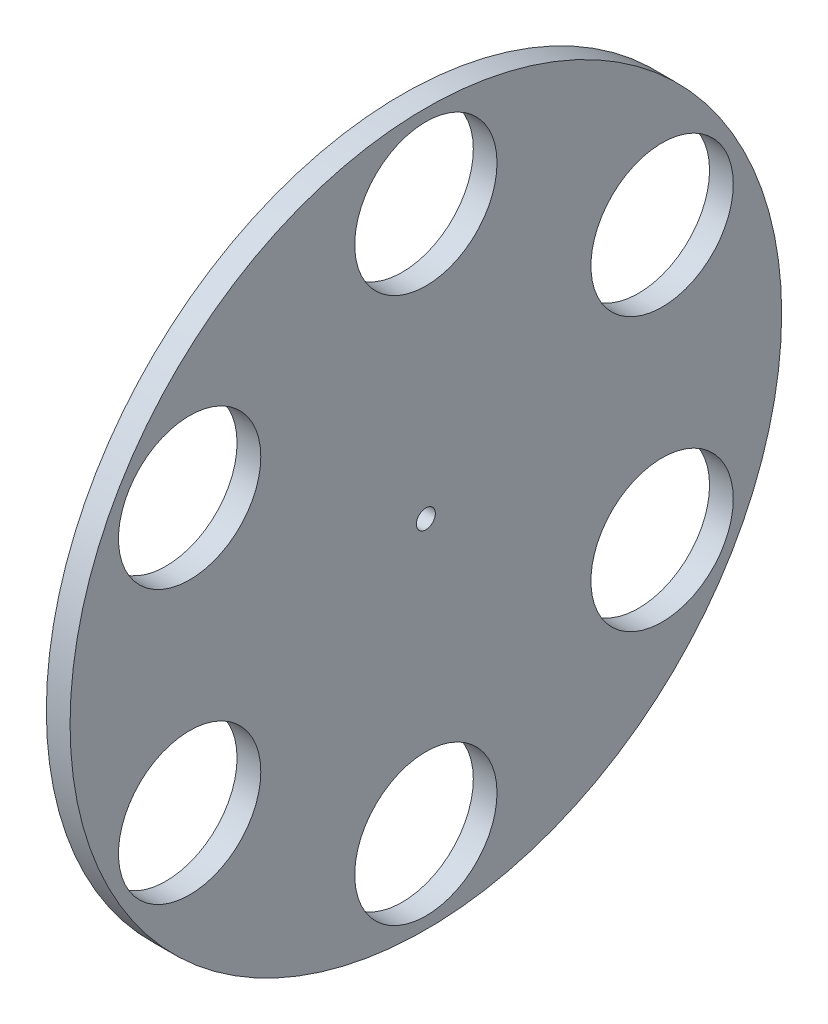
ISO-10303-21;
HEADER;
FILE_DESCRIPTION(('STEP AP214'),'2;1');
FILE_NAME('part.step','',(''),(''),'','','');
FILE_SCHEMA(('AUTOMOTIVE_DESIGN { 1 0 10303 214 1 1 1 1 }'));
ENDSEC;
DATA;
#1=APPLICATION_CONTEXT('core data for automotive mechanical design processes');
#2=APPLICATION_PROTOCOL_DEFINITION('international standard','automotive_design',2000,#1);
#3=PRODUCT_CONTEXT('',#1,'mechanical');
#4=PRODUCT('Part','Part','',(#3));
#5=PRODUCT_RELATED_PRODUCT_CATEGORY('part','',(#4));
#6=PRODUCT_DEFINITION_FORMATION('','',#4);
#7=PRODUCT_DEFINITION_CONTEXT('part definition',#1,'design');
#8=PRODUCT_DEFINITION('design','',#6,#7);
#9=PRODUCT_DEFINITION_SHAPE('','',#8);
#10=(LENGTH_UNIT() NAMED_UNIT(*) SI_UNIT(.MILLI.,.METRE.));
#11=(NAMED_UNIT(*) PLANE_ANGLE_UNIT() SI_UNIT($,.RADIAN.));
#12=(NAMED_UNIT(*) SI_UNIT($,.STERADIAN.) SOLID_ANGLE_UNIT());
#13=UNCERTAINTY_MEASURE_WITH_UNIT(LENGTH_MEASURE(1.E-05),#10,'distance_accuracy_value','');
#14=(GEOMETRIC_REPRESENTATION_CONTEXT(3) GLOBAL_UNCERTAINTY_ASSIGNED_CONTEXT((#13)) GLOBAL_UNIT_ASSIGNED_CONTEXT((#10,
#11,#12)) REPRESENTATION_CONTEXT('',''));
#15=CARTESIAN_POINT('',(0.,0.,0.));
#16=DIRECTION('',(0.,0.,1.));
#17=DIRECTION('',(1.,0.,0.));
#18=AXIS2_PLACEMENT_3D('',#15,#16,#17);
#19=CARTESIAN_POINT('',(10.,0.,0.));
#20=DIRECTION('',(1.,0.,0.));
#21=DIRECTION('',(0.,0.,-1.));
#22=AXIS2_PLACEMENT_3D('',#19,#20,#21);
#23=PLANE('',#22);
#24=CARTESIAN_POINT('',(10.,-57.5000000000089,99.5929214351951));
#25=DIRECTION('',(1.,0.,0.));
#26=DIRECTION('',(0.,0.,-1.));
#27=AXIS2_PLACEMENT_3D('',#24,#25,#26);
#28=CIRCLE('',#27,30.);
#29=CARTESIAN_POINT('',(10.,-57.5000000000089,69.5929214351951));
#30=VERTEX_POINT('',#29);
#31=EDGE_CURVE('E71',#30,#30,#28,.T.);
#32=ORIENTED_EDGE('',*,*,#31,.F.);
#33=EDGE_LOOP('',(#32));
#34=FACE_BOUND('',#33,.T.);
#35=CARTESIAN_POINT('',(10.,-57.4999999999911,-99.5929214352258));
#36=DIRECTION('',(1.,0.,0.));
#37=DIRECTION('',(0.,0.,-1.));
#38=AXIS2_PLACEMENT_3D('',#35,#36,#37);
#39=CIRCLE('',#38,30.);
#40=CARTESIAN_POINT('',(10.,-57.4999999999911,-129.592921435226));
#41=VERTEX_POINT('',#40);
#42=EDGE_CURVE('E59',#41,#41,#39,.T.);
#43=ORIENTED_EDGE('',*,*,#42,.F.);
#44=EDGE_LOOP('',(#43));
#45=FACE_BOUND('',#44,.T.);
#46=CARTESIAN_POINT('',(10.,115.,0.));
#47=DIRECTION('',(1.,0.,0.));
#48=DIRECTION('',(0.,0.,-1.));
#49=AXIS2_PLACEMENT_3D('',#46,#47,#48);
#50=CIRCLE('',#49,30.);
#51=CARTESIAN_POINT('',(10.,115.,-30.));
#52=VERTEX_POINT('',#51);
#53=EDGE_CURVE('E47',#52,#52,#50,.T.);
#54=ORIENTED_EDGE('',*,*,#53,.F.);
#55=EDGE_LOOP('',(#54));
#56=FACE_BOUND('',#55,.T.);
#57=CARTESIAN_POINT('',(10.,0.,0.));
#58=DIRECTION('',(1.,0.,0.));
#59=DIRECTION('',(0.,0.,-1.));
#60=AXIS2_PLACEMENT_3D('',#57,#58,#59);
#61=CIRCLE('',#60,150.);
#62=CARTESIAN_POINT('',(10.,0.,-150.));
#63=VERTEX_POINT('',#62);
#64=EDGE_CURVE('E10',#63,#63,#61,.T.);
#65=ORIENTED_EDGE('',*,*,#64,.T.);
#66=EDGE_LOOP('',(#65));
#67=FACE_BOUND('',#66,.T.);
#68=CARTESIAN_POINT('',(10.,0.,0.));
#69=DIRECTION('',(1.,0.,0.));
#70=DIRECTION('',(0.,0.,-1.));
#71=AXIS2_PLACEMENT_3D('',#68,#69,#70);
#72=CIRCLE('',#71,4.);
#73=CARTESIAN_POINT('',(10.,0.,-4.));
#74=VERTEX_POINT('',#73);
#75=EDGE_CURVE('E42',#74,#74,#72,.T.);
#76=ORIENTED_EDGE('',*,*,#75,.F.);
#77=EDGE_LOOP('',(#76));
#78=FACE_BOUND('',#77,.T.);
#79=CARTESIAN_POINT('',(10.,57.5000000000089,-99.5929214352155));
#80=DIRECTION('',(1.,0.,0.));
#81=DIRECTION('',(0.,0.,-1.));
#82=AXIS2_PLACEMENT_3D('',#79,#80,#81);
#83=CIRCLE('',#82,30.);
#84=CARTESIAN_POINT('',(10.,57.5000000000089,-129.592921435216));
#85=VERTEX_POINT('',#84);
#86=EDGE_CURVE('E53',#85,#85,#83,.T.);
#87=ORIENTED_EDGE('',*,*,#86,.F.);
#88=EDGE_LOOP('',(#87));
#89=FACE_BOUND('',#88,.T.);
#90=CARTESIAN_POINT('',(10.,-115.,-2.04115833009271E-11));
#91=DIRECTION('',(1.,0.,0.));
#92=DIRECTION('',(0.,0.,-1.));
#93=AXIS2_PLACEMENT_3D('',#90,#91,#92);
#94=CIRCLE('',#93,30.);
#95=CARTESIAN_POINT('',(10.,-115.,-30.0000000000204));
#96=VERTEX_POINT('',#95);
#97=EDGE_CURVE('E65',#96,#96,#94,.T.);
#98=ORIENTED_EDGE('',*,*,#97,.F.);
#99=EDGE_LOOP('',(#98));
#100=FACE_BOUND('',#99,.T.);
#101=CARTESIAN_POINT('',(10.,57.4999999999911,99.5929214352054));
#102=DIRECTION('',(1.,0.,0.));
#103=DIRECTION('',(0.,0.,-1.));
#104=AXIS2_PLACEMENT_3D('',#101,#102,#103);
#105=CIRCLE('',#104,30.);
#106=CARTESIAN_POINT('',(10.,57.4999999999911,69.5929214352054));
#107=VERTEX_POINT('',#106);
#108=EDGE_CURVE('E77',#107,#107,#105,.T.);
#109=ORIENTED_EDGE('',*,*,#108,.F.);
#110=EDGE_LOOP('',(#109));
#111=FACE_BOUND('',#110,.T.);
#112=ADVANCED_FACE('F31',(#34,#45,#56,#67,#78,#89,#100,#111),#23,.T.);
#113=CARTESIAN_POINT('',(0.,0.,0.));
#114=DIRECTION('',(1.,0.,0.));
#115=DIRECTION('',(0.,0.,-1.));
#116=AXIS2_PLACEMENT_3D('',#113,#114,#115);
#117=PLANE('',#116);
#118=CARTESIAN_POINT('',(0.,0.,0.));
#119=DIRECTION('',(1.,0.,0.));
#120=DIRECTION('',(0.,0.,-1.));
#121=AXIS2_PLACEMENT_3D('',#118,#119,#120);
#122=CIRCLE('',#121,150.);
#123=CARTESIAN_POINT('',(0.,0.,-150.));
#124=VERTEX_POINT('',#123);
#125=EDGE_CURVE('E35',#124,#124,#122,.T.);
#126=ORIENTED_EDGE('',*,*,#125,.F.);
#127=EDGE_LOOP('',(#126));
#128=FACE_BOUND('',#127,.T.);
#129=CARTESIAN_POINT('',(0.,0.,0.));
#130=DIRECTION('',(1.,0.,0.));
#131=DIRECTION('',(0.,0.,-1.));
#132=AXIS2_PLACEMENT_3D('',#129,#130,#131);
#133=CIRCLE('',#132,4.);
#134=CARTESIAN_POINT('',(0.,0.,-4.));
#135=VERTEX_POINT('',#134);
#136=EDGE_CURVE('E44',#135,#135,#133,.T.);
#137=ORIENTED_EDGE('',*,*,#136,.T.);
#138=EDGE_LOOP('',(#137));
#139=FACE_BOUND('',#138,.T.);
#140=CARTESIAN_POINT('',(0.,115.,0.));
#141=DIRECTION('',(1.,0.,0.));
#142=DIRECTION('',(0.,0.,-1.));
#143=AXIS2_PLACEMENT_3D('',#140,#141,#142);
#144=CIRCLE('',#143,30.);
#145=CARTESIAN_POINT('',(0.,115.,-30.));
#146=VERTEX_POINT('',#145);
#147=EDGE_CURVE('E50',#146,#146,#144,.T.);
#148=ORIENTED_EDGE('',*,*,#147,.T.);
#149=EDGE_LOOP('',(#148));
#150=FACE_BOUND('',#149,.T.);
#151=CARTESIAN_POINT('',(0.,57.5000000000089,-99.5929214352155));
#152=DIRECTION('',(1.,0.,0.));
#153=DIRECTION('',(0.,0.,-1.));
#154=AXIS2_PLACEMENT_3D('',#151,#152,#153);
#155=CIRCLE('',#154,30.);
#156=CARTESIAN_POINT('',(0.,57.5000000000089,-129.592921435216));
#157=VERTEX_POINT('',#156);
#158=EDGE_CURVE('E56',#157,#157,#155,.T.);
#159=ORIENTED_EDGE('',*,*,#158,.T.);
#160=EDGE_LOOP('',(#159));
#161=FACE_BOUND('',#160,.T.);
#162=CARTESIAN_POINT('',(0.,-57.4999999999911,-99.5929214352258));
#163=DIRECTION('',(1.,0.,0.));
#164=DIRECTION('',(0.,0.,-1.));
#165=AXIS2_PLACEMENT_3D('',#162,#163,#164);
#166=CIRCLE('',#165,30.);
#167=CARTESIAN_POINT('',(0.,-57.4999999999911,-129.592921435226));
#168=VERTEX_POINT('',#167);
#169=EDGE_CURVE('E62',#168,#168,#166,.T.);
#170=ORIENTED_EDGE('',*,*,#169,.T.);
#171=EDGE_LOOP('',(#170));
#172=FACE_BOUND('',#171,.T.);
#173=CARTESIAN_POINT('',(0.,-115.,-2.04115833009271E-11));
#174=DIRECTION('',(1.,0.,0.));
#175=DIRECTION('',(0.,0.,-1.));
#176=AXIS2_PLACEMENT_3D('',#173,#174,#175);
#177=CIRCLE('',#176,30.);
#178=CARTESIAN_POINT('',(0.,-115.,-30.0000000000204));
#179=VERTEX_POINT('',#178);
#180=EDGE_CURVE('E68',#179,#179,#177,.T.);
#181=ORIENTED_EDGE('',*,*,#180,.T.);
#182=EDGE_LOOP('',(#181));
#183=FACE_BOUND('',#182,.T.);
#184=CARTESIAN_POINT('',(0.,-57.5000000000089,99.5929214351951));
#185=DIRECTION('',(1.,0.,0.));
#186=DIRECTION('',(0.,0.,-1.));
#187=AXIS2_PLACEMENT_3D('',#184,#185,#186);
#188=CIRCLE('',#187,30.);
#189=CARTESIAN_POINT('',(0.,-57.5000000000089,69.5929214351951));
#190=VERTEX_POINT('',#189);
#191=EDGE_CURVE('E74',#190,#190,#188,.T.);
#192=ORIENTED_EDGE('',*,*,#191,.T.);
#193=EDGE_LOOP('',(#192));
#194=FACE_BOUND('',#193,.T.);
#195=CARTESIAN_POINT('',(0.,57.4999999999911,99.5929214352054));
#196=DIRECTION('',(1.,0.,0.));
#197=DIRECTION('',(0.,0.,-1.));
#198=AXIS2_PLACEMENT_3D('',#195,#196,#197);
#199=CIRCLE('',#198,30.);
#200=CARTESIAN_POINT('',(0.,57.4999999999911,69.5929214352054));
#201=VERTEX_POINT('',#200);
#202=EDGE_CURVE('E80',#201,#201,#199,.T.);
#203=ORIENTED_EDGE('',*,*,#202,.T.);
#204=EDGE_LOOP('',(#203));
#205=FACE_BOUND('',#204,.T.);
#206=ADVANCED_FACE('F90',(#128,#139,#150,#161,#172,#183,#194,#205),#117,.F.);
#207=CARTESIAN_POINT('',(10.,0.,0.));
#208=DIRECTION('',(-1.,0.,0.));
#209=DIRECTION('',(0.,0.,1.));
#210=AXIS2_PLACEMENT_3D('',#207,#208,#209);
#211=CYLINDRICAL_SURFACE('',#210,150.);
#212=ORIENTED_EDGE('',*,*,#64,.F.);
#213=EDGE_LOOP('',(#212));
#214=FACE_BOUND('',#213,.T.);
#215=ORIENTED_EDGE('',*,*,#125,.T.);
#216=EDGE_LOOP('',(#215));
#217=FACE_BOUND('',#216,.T.);
#218=ADVANCED_FACE('F33',(#214,#217),#211,.T.);
#219=CARTESIAN_POINT('',(10.,0.,0.));
#220=DIRECTION('',(-1.,0.,0.));
#221=DIRECTION('',(0.,0.,1.));
#222=AXIS2_PLACEMENT_3D('',#219,#220,#221);
#223=CYLINDRICAL_SURFACE('',#222,4.);
#224=ORIENTED_EDGE('',*,*,#75,.T.);
#225=EDGE_LOOP('',(#224));
#226=FACE_BOUND('',#225,.T.);
#227=ORIENTED_EDGE('',*,*,#136,.F.);
#228=EDGE_LOOP('',(#227));
#229=FACE_BOUND('',#228,.T.);
#230=ADVANCED_FACE('F100',(#226,#229),#223,.F.);
#231=CARTESIAN_POINT('',(10.,115.,0.));
#232=DIRECTION('',(-1.,0.,0.));
#233=DIRECTION('',(0.,0.,1.));
#234=AXIS2_PLACEMENT_3D('',#231,#232,#233);
#235=CYLINDRICAL_SURFACE('',#234,30.);
#236=ORIENTED_EDGE('',*,*,#53,.T.);
#237=EDGE_LOOP('',(#236));
#238=FACE_BOUND('',#237,.T.);
#239=ORIENTED_EDGE('',*,*,#147,.F.);
#240=EDGE_LOOP('',(#239));
#241=FACE_BOUND('',#240,.T.);
#242=ADVANCED_FACE('F103',(#238,#241),#235,.F.);
#243=CARTESIAN_POINT('',(10.,57.5000000000089,-99.5929214352155));
#244=DIRECTION('',(-1.,0.,0.));
#245=DIRECTION('',(0.,0.,1.));
#246=AXIS2_PLACEMENT_3D('',#243,#244,#245);
#247=CYLINDRICAL_SURFACE('',#246,30.);
#248=ORIENTED_EDGE('',*,*,#86,.T.);
#249=EDGE_LOOP('',(#248));
#250=FACE_BOUND('',#249,.T.);
#251=ORIENTED_EDGE('',*,*,#158,.F.);
#252=EDGE_LOOP('',(#251));
#253=FACE_BOUND('',#252,.T.);
#254=ADVANCED_FACE('F107',(#250,#253),#247,.F.);
#255=CARTESIAN_POINT('',(10.,-57.4999999999911,-99.5929214352258));
#256=DIRECTION('',(-1.,0.,0.));
#257=DIRECTION('',(0.,0.,1.));
#258=AXIS2_PLACEMENT_3D('',#255,#256,#257);
#259=CYLINDRICAL_SURFACE('',#258,30.);
#260=ORIENTED_EDGE('',*,*,#42,.T.);
#261=EDGE_LOOP('',(#260));
#262=FACE_BOUND('',#261,.T.);
#263=ORIENTED_EDGE('',*,*,#169,.F.);
#264=EDGE_LOOP('',(#263));
#265=FACE_BOUND('',#264,.T.);
#266=ADVANCED_FACE('F111',(#262,#265),#259,.F.);
#267=CARTESIAN_POINT('',(10.,-115.,-2.04115833009271E-11));
#268=DIRECTION('',(-1.,0.,0.));
#269=DIRECTION('',(0.,0.,1.));
#270=AXIS2_PLACEMENT_3D('',#267,#268,#269);
#271=CYLINDRICAL_SURFACE('',#270,30.);
#272=ORIENTED_EDGE('',*,*,#97,.T.);
#273=EDGE_LOOP('',(#272));
#274=FACE_BOUND('',#273,.T.);
#275=ORIENTED_EDGE('',*,*,#180,.F.);
#276=EDGE_LOOP('',(#275));
#277=FACE_BOUND('',#276,.T.);
#278=ADVANCED_FACE('F115',(#274,#277),#271,.F.);
#279=CARTESIAN_POINT('',(10.,-57.5000000000089,99.5929214351951));
#280=DIRECTION('',(-1.,0.,0.));
#281=DIRECTION('',(0.,0.,1.));
#282=AXIS2_PLACEMENT_3D('',#279,#280,#281);
#283=CYLINDRICAL_SURFACE('',#282,30.);
#284=ORIENTED_EDGE('',*,*,#31,.T.);
#285=EDGE_LOOP('',(#284));
#286=FACE_BOUND('',#285,.T.);
#287=ORIENTED_EDGE('',*,*,#191,.F.);
#288=EDGE_LOOP('',(#287));
#289=FACE_BOUND('',#288,.T.);
#290=ADVANCED_FACE('F119',(#286,#289),#283,.F.);
#291=CARTESIAN_POINT('',(10.,57.4999999999911,99.5929214352054));
#292=DIRECTION('',(-1.,0.,0.));
#293=DIRECTION('',(0.,0.,1.));
#294=AXIS2_PLACEMENT_3D('',#291,#292,#293);
#295=CYLINDRICAL_SURFACE('',#294,30.);
#296=ORIENTED_EDGE('',*,*,#108,.T.);
#297=EDGE_LOOP('',(#296));
#298=FACE_BOUND('',#297,.T.);
#299=ORIENTED_EDGE('',*,*,#202,.F.);
#300=EDGE_LOOP('',(#299));
#301=FACE_BOUND('',#300,.T.);
#302=ADVANCED_FACE('F86',(#298,#301),#295,.F.);
#303=CLOSED_SHELL('',(#112,#206,#218,#230,#242,#254,#266,#278,#290,#302));
#304=MANIFOLD_SOLID_BREP('B2',#303);
#305=ADVANCED_BREP_SHAPE_REPRESENTATION('',(#18,#304),#14);
#306=SHAPE_DEFINITION_REPRESENTATION(#9,#305);
ENDSEC;
END-ISO-10303-21;
